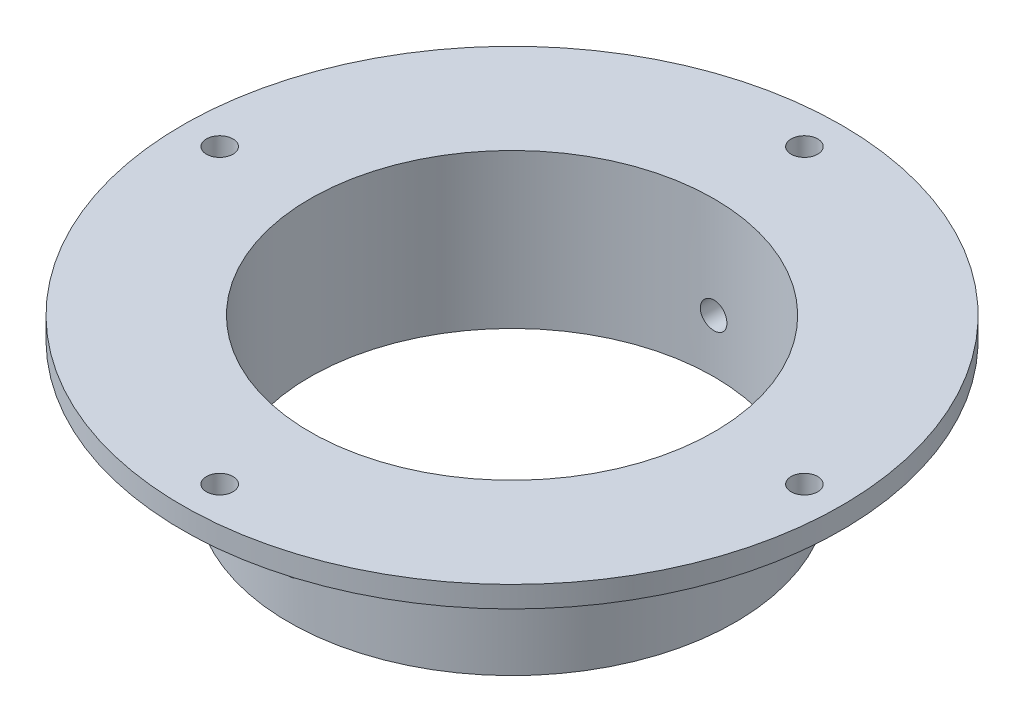
ISO-10303-21;
HEADER;
FILE_DESCRIPTION(('STEP AP214'),'2;1');
FILE_NAME('part.step','',(''),(''),'','','');
FILE_SCHEMA(('AUTOMOTIVE_DESIGN { 1 0 10303 214 1 1 1 1 }'));
ENDSEC;
DATA;
#1=APPLICATION_CONTEXT('core data for automotive mechanical design processes');
#2=APPLICATION_PROTOCOL_DEFINITION('international standard','automotive_design',2000,#1);
#3=PRODUCT_CONTEXT('',#1,'mechanical');
#4=PRODUCT('Part','Part','',(#3));
#5=PRODUCT_RELATED_PRODUCT_CATEGORY('part','',(#4));
#6=PRODUCT_DEFINITION_FORMATION('','',#4);
#7=PRODUCT_DEFINITION_CONTEXT('part definition',#1,'design');
#8=PRODUCT_DEFINITION('design','',#6,#7);
#9=PRODUCT_DEFINITION_SHAPE('','',#8);
#10=(LENGTH_UNIT() NAMED_UNIT(*) SI_UNIT(.MILLI.,.METRE.));
#11=(NAMED_UNIT(*) PLANE_ANGLE_UNIT() SI_UNIT($,.RADIAN.));
#12=(NAMED_UNIT(*) SI_UNIT($,.STERADIAN.) SOLID_ANGLE_UNIT());
#13=UNCERTAINTY_MEASURE_WITH_UNIT(LENGTH_MEASURE(1.E-05),#10,'distance_accuracy_value','');
#14=(GEOMETRIC_REPRESENTATION_CONTEXT(3) GLOBAL_UNCERTAINTY_ASSIGNED_CONTEXT((#13)) GLOBAL_UNIT_ASSIGNED_CONTEXT((#10,
#11,#12)) REPRESENTATION_CONTEXT('',''));
#15=CARTESIAN_POINT('',(0.,0.,0.));
#16=DIRECTION('',(0.,0.,1.));
#17=DIRECTION('',(1.,0.,0.));
#18=AXIS2_PLACEMENT_3D('',#15,#16,#17);
#19=CARTESIAN_POINT('',(0.,-100.5,0.));
#20=DIRECTION('',(0.,-1.,0.));
#21=DIRECTION('',(0.,0.,-1.));
#22=AXIS2_PLACEMENT_3D('',#19,#20,#21);
#23=CYLINDRICAL_SURFACE('',#22,62.);
#24=CARTESIAN_POINT('',(0.,-4.,0.));
#25=DIRECTION('',(0.,-1.,0.));
#26=DIRECTION('',(0.,0.,-1.));
#27=AXIS2_PLACEMENT_3D('',#24,#25,#26);
#28=CIRCLE('',#27,62.);
#29=CARTESIAN_POINT('',(0.,-4.,-62.));
#30=VERTEX_POINT('',#29);
#31=EDGE_CURVE('E144',#30,#30,#28,.T.);
#32=ORIENTED_EDGE('',*,*,#31,.F.);
#33=EDGE_LOOP('',(#32));
#34=FACE_BOUND('',#33,.T.);
#35=CARTESIAN_POINT('',(0.,0.,0.));
#36=DIRECTION('',(0.,-1.,0.));
#37=DIRECTION('',(0.,0.,-1.));
#38=AXIS2_PLACEMENT_3D('',#35,#36,#37);
#39=CIRCLE('',#38,62.);
#40=CARTESIAN_POINT('',(0.,0.,-62.));
#41=VERTEX_POINT('',#40);
#42=EDGE_CURVE('E10',#41,#41,#39,.T.);
#43=ORIENTED_EDGE('',*,*,#42,.T.);
#44=EDGE_LOOP('',(#43));
#45=FACE_BOUND('',#44,.T.);
#46=ADVANCED_FACE('F41',(#34,#45),#23,.T.);
#47=CARTESIAN_POINT('',(-62.,0.,0.));
#48=DIRECTION('',(0.,-1.,0.));
#49=DIRECTION('',(0.,0.,-1.));
#50=AXIS2_PLACEMENT_3D('',#47,#48,#49);
#51=PLANE('',#50);
#52=CARTESIAN_POINT('',(55.,0.,0.));
#53=DIRECTION('',(0.,-1.,0.));
#54=DIRECTION('',(0.,0.,-1.));
#55=AXIS2_PLACEMENT_3D('',#52,#53,#54);
#56=CIRCLE('',#55,2.49999999999999);
#57=CARTESIAN_POINT('',(55.,0.,-2.49999999999999));
#58=VERTEX_POINT('',#57);
#59=EDGE_CURVE('E114',#58,#58,#56,.T.);
#60=ORIENTED_EDGE('',*,*,#59,.T.);
#61=EDGE_LOOP('',(#60));
#62=FACE_BOUND('',#61,.T.);
#63=CARTESIAN_POINT('',(-55.,0.,0.));
#64=DIRECTION('',(0.,-1.,0.));
#65=DIRECTION('',(0.,0.,-1.));
#66=AXIS2_PLACEMENT_3D('',#63,#64,#65);
#67=CIRCLE('',#66,2.49999999999999);
#68=CARTESIAN_POINT('',(-55.,0.,-2.49999999999999));
#69=VERTEX_POINT('',#68);
#70=EDGE_CURVE('E118',#69,#69,#67,.T.);
#71=ORIENTED_EDGE('',*,*,#70,.T.);
#72=EDGE_LOOP('',(#71));
#73=FACE_BOUND('',#72,.T.);
#74=CARTESIAN_POINT('',(0.,0.,55.));
#75=DIRECTION('',(0.,-1.,0.));
#76=DIRECTION('',(0.,0.,-1.));
#77=AXIS2_PLACEMENT_3D('',#74,#75,#76);
#78=CIRCLE('',#77,2.5);
#79=CARTESIAN_POINT('',(0.,0.,52.5));
#80=VERTEX_POINT('',#79);
#81=EDGE_CURVE('E122',#80,#80,#78,.T.);
#82=ORIENTED_EDGE('',*,*,#81,.T.);
#83=EDGE_LOOP('',(#82));
#84=FACE_BOUND('',#83,.T.);
#85=CARTESIAN_POINT('',(0.,0.,-55.));
#86=DIRECTION('',(0.,-1.,0.));
#87=DIRECTION('',(0.,0.,-1.));
#88=AXIS2_PLACEMENT_3D('',#85,#86,#87);
#89=CIRCLE('',#88,2.5);
#90=CARTESIAN_POINT('',(0.,0.,-57.5));
#91=VERTEX_POINT('',#90);
#92=EDGE_CURVE('E126',#91,#91,#89,.T.);
#93=ORIENTED_EDGE('',*,*,#92,.T.);
#94=EDGE_LOOP('',(#93));
#95=FACE_BOUND('',#94,.T.);
#96=ORIENTED_EDGE('',*,*,#42,.F.);
#97=EDGE_LOOP('',(#96));
#98=FACE_BOUND('',#97,.T.);
#99=CARTESIAN_POINT('',(0.,0.,0.));
#100=DIRECTION('',(0.,-1.,0.));
#101=DIRECTION('',(0.,0.,-1.));
#102=AXIS2_PLACEMENT_3D('',#99,#100,#101);
#103=CIRCLE('',#102,38.);
#104=CARTESIAN_POINT('',(0.,0.,-38.));
#105=VERTEX_POINT('',#104);
#106=EDGE_CURVE('E54',#105,#105,#103,.T.);
#107=ORIENTED_EDGE('',*,*,#106,.T.);
#108=EDGE_LOOP('',(#107));
#109=FACE_BOUND('',#108,.T.);
#110=ADVANCED_FACE('F102',(#62,#73,#84,#95,#98,#109),#51,.F.);
#111=CARTESIAN_POINT('',(0.,-100.5,0.));
#112=DIRECTION('',(0.,-1.,0.));
#113=DIRECTION('',(0.,0.,-1.));
#114=AXIS2_PLACEMENT_3D('',#111,#112,#113);
#115=CYLINDRICAL_SURFACE('',#114,38.);
#116=CARTESIAN_POINT('',(0.,-16.5,-38.));
#117=CARTESIAN_POINT('',(0.140263338640111,-16.5000061657034,-37.9999989089088));
#118=CARTESIAN_POINT('',(0.280624510567204,-16.5118439540765,-37.9992151008519));
#119=CARTESIAN_POINT('',(0.557470077475564,-16.5588967165258,-37.9961636901737));
#120=CARTESIAN_POINT('',(0.693949785301588,-16.5941387990094,-37.993894366974));
#121=CARTESIAN_POINT('',(0.958982303444851,-16.6869825710089,-37.9881286089382));
#122=CARTESIAN_POINT('',(1.08753929536543,-16.7445723462569,-37.9846328280609));
#123=CARTESIAN_POINT('',(1.33312858370056,-16.8804571374235,-37.9768071728354));
#124=CARTESIAN_POINT('',(1.45016348693039,-16.9587474551055,-37.9724774878122));
#125=CARTESIAN_POINT('',(1.66961202724024,-17.1339515865147,-37.9634626250822));
#126=CARTESIAN_POINT('',(1.77200420008546,-17.230892261019,-37.9587769406168));
#127=CARTESIAN_POINT('',(1.95907706932224,-17.4405896661527,-37.9495824974991));
#128=CARTESIAN_POINT('',(2.04375702050908,-17.5533470619043,-37.9450737462973));
#129=CARTESIAN_POINT('',(2.19306912808149,-17.7916003582801,-37.9367376727092));
#130=CARTESIAN_POINT('',(2.25768324964759,-17.9171075845717,-37.9329109646397));
#131=CARTESIAN_POINT('',(2.36491418395718,-18.1772185275759,-37.9263771482206));
#132=CARTESIAN_POINT('',(2.40753125425532,-18.3118221377618,-37.9236700267624));
#133=CARTESIAN_POINT('',(2.46949823281524,-18.5860964566405,-37.9196855382056));
#134=CARTESIAN_POINT('',(2.4888820420221,-18.7257594753212,-37.9184060881012));
#135=CARTESIAN_POINT('',(2.50393692695256,-19.0063623003731,-37.9174149912351));
#136=CARTESIAN_POINT('',(2.49960829570425,-19.147302090945,-37.9177033250993));
#137=CARTESIAN_POINT('',(2.46738928684178,-19.4262265147583,-37.9198133472868));
#138=CARTESIAN_POINT('',(2.43953561602796,-19.5642154086451,-37.9216326467838));
#139=CARTESIAN_POINT('',(2.36111413978203,-19.8335549308764,-37.9265958226422));
#140=CARTESIAN_POINT('',(2.31054618626762,-19.9649055159373,-37.9297397076388));
#141=CARTESIAN_POINT('',(2.18808999165326,-20.2173576558678,-37.9370005183096));
#142=CARTESIAN_POINT('',(2.1161851246853,-20.3384511233859,-37.9411182022646));
#143=CARTESIAN_POINT('',(1.95310825671474,-20.5668632100567,-37.949861837488));
#144=CARTESIAN_POINT('',(1.86193601494282,-20.6741816570468,-37.9544877951075));
#145=CARTESIAN_POINT('',(1.66270582371165,-20.8722108732715,-37.9637372885605));
#146=CARTESIAN_POINT('',(1.5546161115177,-20.962889691217,-37.9683608030819));
#147=CARTESIAN_POINT('',(1.32473052430288,-21.1248190741905,-37.9770759456802));
#148=CARTESIAN_POINT('',(1.20293464399362,-21.1960696317222,-37.9811675735518));
#149=CARTESIAN_POINT('',(0.949074486518493,-21.3171173467021,-37.9883582687231));
#150=CARTESIAN_POINT('',(0.817009617015091,-21.3669132655151,-37.9914572787137));
#151=CARTESIAN_POINT('',(0.546369095952173,-21.4436166933401,-37.9963127799458));
#152=CARTESIAN_POINT('',(0.407793528652135,-21.470524498477,-37.9980692885564));
#153=CARTESIAN_POINT('',(0.128342446210268,-21.5006482288441,-38.0000396241101));
#154=CARTESIAN_POINT('',(-0.0125282882294702,-21.5039083237349,-38.000256327117));
#155=CARTESIAN_POINT('',(-0.292814563294638,-21.4867595416941,-37.9991302871387));
#156=CARTESIAN_POINT('',(-0.432230112318582,-21.4663508014419,-37.9977875531587));
#157=CARTESIAN_POINT('',(-0.705523880511251,-21.4024802560411,-37.9936956265147));
#158=CARTESIAN_POINT('',(-0.839406862626701,-21.3590387449292,-37.9909476720577));
#159=CARTESIAN_POINT('',(-1.0979821322638,-21.2503564304151,-37.9843543930686));
#160=CARTESIAN_POINT('',(-1.22267432827148,-21.1851154099879,-37.9805090576117));
#161=CARTESIAN_POINT('',(-1.45953056554176,-21.0345737907095,-37.972145780786));
#162=CARTESIAN_POINT('',(-1.57167584294263,-20.9492437250458,-37.9676268549948));
#163=CARTESIAN_POINT('',(-1.78006588645928,-20.7609890681081,-37.9584281419056));
#164=CARTESIAN_POINT('',(-1.87631047952118,-20.6580642853683,-37.9537483528577));
#165=CARTESIAN_POINT('',(-2.05031700979284,-20.4373511319252,-37.9447469988241));
#166=CARTESIAN_POINT('',(-2.12805026816539,-20.3195401252357,-37.94042599635));
#167=CARTESIAN_POINT('',(-2.26263133128356,-20.0725123600299,-37.9326384937239));
#168=CARTESIAN_POINT('',(-2.319479276074,-19.9432956780007,-37.9291719878422));
#169=CARTESIAN_POINT('',(-2.41062645747182,-19.6772288551144,-37.9234884778725));
#170=CARTESIAN_POINT('',(-2.44494367555515,-19.5403848963543,-37.9212704775707));
#171=CARTESIAN_POINT('',(-2.49011396544168,-19.2628623134452,-37.918331354935));
#172=CARTESIAN_POINT('',(-2.50096730016958,-19.1221837322829,-37.917610215828));
#173=CARTESIAN_POINT('',(-2.49889914486143,-18.8412703821744,-37.9177465482503));
#174=CARTESIAN_POINT('',(-2.48602273732584,-18.7010352776421,-37.9186010263749));
#175=CARTESIAN_POINT('',(-2.4369541559189,-18.4247230460584,-37.9217859619313));
#176=CARTESIAN_POINT('',(-2.40076194057309,-18.2886459264036,-37.9241164219887));
#177=CARTESIAN_POINT('',(-2.30609945749711,-18.0245061909025,-37.9299899650734));
#178=CARTESIAN_POINT('',(-2.24762947243981,-17.8964434733888,-37.9335330327144));
#179=CARTESIAN_POINT('',(-2.11007715990923,-17.6519462585653,-37.9414324891205));
#180=CARTESIAN_POINT('',(-2.03099533692235,-17.5355114767517,-37.9457888579789));
#181=CARTESIAN_POINT('',(-1.85429682254946,-17.3173461843869,-37.954833700614));
#182=CARTESIAN_POINT('',(-1.75664736286435,-17.2156422385455,-37.9595227521995));
#183=CARTESIAN_POINT('',(-1.54563286085883,-17.0300342107064,-37.9686995719977));
#184=CARTESIAN_POINT('',(-1.43226398542784,-16.9461344828543,-37.9731872907619));
#185=CARTESIAN_POINT('',(-1.19288750338034,-16.798447827037,-37.9814608860298));
#186=CARTESIAN_POINT('',(-1.06686338419818,-16.7346876386072,-37.985245826722));
#187=CARTESIAN_POINT('',(-0.805964550763279,-16.6293102471819,-37.9916751144093));
#188=CARTESIAN_POINT('',(-0.671100383637576,-16.5876671774824,-37.9943207931204));
#189=CARTESIAN_POINT('',(-0.446179257536459,-16.5384993453469,-37.9974820960572));
#190=CARTESIAN_POINT('',(-0.357575215516564,-16.5240808311296,-37.9984220996303));
#191=CARTESIAN_POINT('',(-0.179327446866825,-16.5048291947172,-37.9996813999403));
#192=CARTESIAN_POINT('',(-0.0896837218472607,-16.4999960576781,-38.0000006976386));
#193=CARTESIAN_POINT('',(0.,-16.5,-38.));
#194=B_SPLINE_CURVE_WITH_KNOTS('',3,(#116,#117,#118,#119,#120,#121,#122,#123,#124,#125,#126,
#127,#128,#129,#130,#131,#132,#133,#134,#135,#136,#137,#138,#139,#140,#141,#142,#143,#144,#145,
#146,#147,#148,#149,#150,#151,#152,#153,#154,#155,#156,#157,#158,#159,#160,#161,#162,#163,#164,
#165,#166,#167,#168,#169,#170,#171,#172,#173,#174,#175,#176,#177,#178,#179,#180,#181,#182,#183,
#184,#185,#186,#187,#188,#189,#190,#191,#192,#193),.UNSPECIFIED.,.T.,.F.,(4,2,2,2,2,2,2,2,2,2,2,
2,2,2,2,2,2,2,2,2,2,2,2,2,2,2,2,2,2,2,2,2,2,2,2,2,2,2,4),(0.,0.420462610994175,
0.841413081079643,1.26213943668888,1.68277038524409,2.10401173600149,2.52527080604525,
2.94690740790406,3.36853907287704,3.78955475970551,4.21056524381557,4.63092002409859,
5.0512775448603,5.47196347503219,5.89265466249842,6.31414539270181,6.73563628553364,
7.1571515089345,7.57866127871498,7.99938354099967,8.42010337376711,8.84045312732508,
9.26080706580026,9.68178146800256,10.1027604515455,10.5243874578755,10.9460116369673,
11.3672989129969,11.7885814682647,12.2090644828285,12.629548245355,13.0500266727249,
13.4704948096136,13.8917119970443,14.3130320776635,14.7349092218268,15.1562918740891,
15.4251341147867,15.693975939152),.UNSPECIFIED.);
#195=CARTESIAN_POINT('',(0.,-16.5,-38.));
#196=VERTEX_POINT('',#195);
#197=EDGE_CURVE('E93',#196,#196,#194,.T.);
#198=ORIENTED_EDGE('',*,*,#197,.T.);
#199=EDGE_LOOP('',(#198));
#200=FACE_BOUND('',#199,.T.);
#201=CARTESIAN_POINT('',(2.5,-19.,37.9176739792936));
#202=CARTESIAN_POINT('',(2.49999383396114,-18.8597370317807,37.9176750792177));
#203=CARTESIAN_POINT('',(2.48815610599765,-18.7193762290357,37.9184606296487));
#204=CARTESIAN_POINT('',(2.44110360532757,-18.4425314292272,37.9215182656392));
#205=CARTESIAN_POINT('',(2.40586172295285,-18.3060521196082,37.9237920750455));
#206=CARTESIAN_POINT('',(2.31301853640162,-18.0410204432686,37.9295675678257));
#207=CARTESIAN_POINT('',(2.25542915603201,-17.9124638915718,37.9330685963044));
#208=CARTESIAN_POINT('',(2.1195452946128,-17.6668753400403,37.9409032159641));
#209=CARTESIAN_POINT('',(2.04125551082236,-17.5498407339459,37.9452366182051));
#210=CARTESIAN_POINT('',(1.86605191732922,-17.3303918547827,37.9542557951937));
#211=CARTESIAN_POINT('',(1.76911112770861,-17.2279991408587,37.9589420743505));
#212=CARTESIAN_POINT('',(1.55941326560947,-17.0409252282869,37.9681342909321));
#213=CARTESIAN_POINT('',(1.44665552947979,-16.9562447731858,37.9726402207795));
#214=CARTESIAN_POINT('',(1.20840193818591,-16.8069321412701,37.980968448039));
#215=CARTESIAN_POINT('',(1.08289481585815,-16.742317906001,37.9847901323703));
#216=CARTESIAN_POINT('',(0.822784098903772,-16.6350867327497,37.991313925933));
#217=CARTESIAN_POINT('',(0.688180610236925,-16.5924695385831,37.9940160482031));
#218=CARTESIAN_POINT('',(0.413906649944332,-16.5305022973315,37.9979927668059));
#219=CARTESIAN_POINT('',(0.27424387041216,-16.511118339785,37.9992694434849));
#220=CARTESIAN_POINT('',(-0.00635848738819494,-16.4960630753301,38.0002584328232));
#221=CARTESIAN_POINT('',(-0.147298049941991,-16.5003914769697,37.9999707647101));
#222=CARTESIAN_POINT('',(-0.426223493960814,-16.5326101251371,37.9978652114935));
#223=CARTESIAN_POINT('',(-0.564213609097607,-16.5604638959155,37.9960496953125));
#224=CARTESIAN_POINT('',(-0.833555522314467,-16.6388859965182,37.9910955429301));
#225=CARTESIAN_POINT('',(-0.964907277764911,-16.6894544721892,37.9879568982333));
#226=CARTESIAN_POINT('',(-1.21736082544108,-16.8119117421081,37.9807057592349));
#227=CARTESIAN_POINT('',(-1.33845459003375,-16.8838170394276,37.9765925116199));
#228=CARTESIAN_POINT('',(-1.56686708778163,-17.0468948227736,37.9678549875776));
#229=CARTESIAN_POINT('',(-1.67418564858962,-17.1380675498251,37.9632307047577));
#230=CARTESIAN_POINT('',(-1.87221430610426,-17.3372980817875,37.9539810952395));
#231=CARTESIAN_POINT('',(-1.96289254980481,-17.4453875512519,37.9493557831635));
#232=CARTESIAN_POINT('',(-2.12482089033198,-17.6752724494904,37.940634326538));
#233=CARTESIAN_POINT('',(-2.19607097850101,-17.7970678843721,37.9365381822242));
#234=CARTESIAN_POINT('',(-2.31711835711865,-18.050927928623,37.929337691078));
#235=CARTESIAN_POINT('',(-2.36691426269517,-18.182993200263,37.9262334082738));
#236=CARTESIAN_POINT('',(-2.44361754049017,-18.4536345943001,37.9213689519858));
#237=CARTESIAN_POINT('',(-2.47052521122867,-18.5922106317555,37.9196087609718));
#238=CARTESIAN_POINT('',(-2.50064843582411,-18.871661921036,37.9176342832836));
#239=CARTESIAN_POINT('',(-2.50390828674319,-19.0125323783637,37.9174171062536));
#240=CARTESIAN_POINT('',(-2.48675911569962,-19.2928180403307,37.9185455955609));
#241=CARTESIAN_POINT('',(-2.4663502304005,-19.432233253368,37.9198912528743));
#242=CARTESIAN_POINT('',(-2.40247973559834,-19.7055254103698,37.9239911291788));
#243=CARTESIAN_POINT('',(-2.35903856489816,-19.8394071513576,37.926744099246));
#244=CARTESIAN_POINT('',(-2.25035734761923,-20.0979800896652,37.9333473147949));
#245=CARTESIAN_POINT('',(-2.18511708202147,-20.2226711946298,37.9371975713012));
#246=CARTESIAN_POINT('',(-2.03457656334725,-20.4595267068433,37.9455684924618));
#247=CARTESIAN_POINT('',(-1.94924665146512,-20.5716722281492,37.9500901446324));
#248=CARTESIAN_POINT('',(-1.76099216330583,-20.7800628355716,37.9592908826962));
#249=CARTESIAN_POINT('',(-1.65806739671881,-20.8763077496815,37.9639699702919));
#250=CARTESIAN_POINT('',(-1.43735409937778,-21.0503149476194,37.9729667977826));
#251=CARTESIAN_POINT('',(-1.31954293050926,-21.1280485502518,37.9772839703115));
#252=CARTESIAN_POINT('',(-1.072514751623,-21.2626302179293,37.9850623603036));
#253=CARTESIAN_POINT('',(-0.943297818113865,-21.3194784230582,37.9885235835078));
#254=CARTESIAN_POINT('',(-0.677231175163814,-21.4106257824592,37.9941973852559));
#255=CARTESIAN_POINT('',(-0.540387686510592,-21.4449430308756,37.9964109655532));
#256=CARTESIAN_POINT('',(-0.262866092954879,-21.490113540815,37.9993440696249));
#257=CARTESIAN_POINT('',(-0.122188030630966,-21.5009670627685,38.0000636099821));
#258=CARTESIAN_POINT('',(0.158725661755483,-21.498899442521,37.9999276075675));
#259=CARTESIAN_POINT('',(0.298961625635898,-21.4860231591756,37.9990750367152));
#260=CARTESIAN_POINT('',(0.575275606267386,-21.4369545233205,37.9958965684063));
#261=CARTESIAN_POINT('',(0.711353615895706,-21.4007621308715,37.993570668426));
#262=CARTESIAN_POINT('',(0.975495095772448,-21.3060989701103,37.9877069032466));
#263=CARTESIAN_POINT('',(1.10355866682703,-21.2476284820792,37.9841690532952));
#264=CARTESIAN_POINT('',(1.34805737805084,-21.1100749002662,37.9762784096942));
#265=CARTESIAN_POINT('',(1.46449280324947,-21.0309923119003,37.9719256360276));
#266=CARTESIAN_POINT('',(1.68265802851112,-20.8542929681005,37.9628848382199));
#267=CARTESIAN_POINT('',(1.78436140467434,-20.7566436185291,37.9581962336842));
#268=CARTESIAN_POINT('',(1.96996833469928,-20.5456295694054,37.9490169164664));
#269=CARTESIAN_POINT('',(2.05386753294152,-20.4322610354967,37.9445262524208));
#270=CARTESIAN_POINT('',(2.20155363291652,-20.1928848191154,37.9362446369121));
#271=CARTESIAN_POINT('',(2.26531369621352,-20.0668605631086,37.9324546219341));
#272=CARTESIAN_POINT('',(2.37069081552761,-19.8059614369942,37.9260153222171));
#273=CARTESIAN_POINT('',(2.41233374013708,-19.6710971148107,37.923364705513));
#274=CARTESIAN_POINT('',(2.46150115422085,-19.4461763784056,37.9201971892467));
#275=CARTESIAN_POINT('',(2.47591948050286,-19.3575729107008,37.919255230483));
#276=CARTESIAN_POINT('',(2.49517086717611,-19.1793262932595,37.9179932743498));
#277=CARTESIAN_POINT('',(2.50000394252144,-19.0896831451452,37.91767327601));
#278=CARTESIAN_POINT('',(2.5,-19.,37.9176739792936));
#279=B_SPLINE_CURVE_WITH_KNOTS('',3,(#201,#202,#203,#204,#205,#206,#207,#208,#209,#210,#211,
#212,#213,#214,#215,#216,#217,#218,#219,#220,#221,#222,#223,#224,#225,#226,#227,#228,#229,#230,
#231,#232,#233,#234,#235,#236,#237,#238,#239,#240,#241,#242,#243,#244,#245,#246,#247,#248,#249,
#250,#251,#252,#253,#254,#255,#256,#257,#258,#259,#260,#261,#262,#263,#264,#265,#266,#267,#268,
#269,#270,#271,#272,#273,#274,#275,#276,#277,#278),.UNSPECIFIED.,.T.,.F.,(4,2,2,2,2,2,2,2,2,2,2,
2,2,2,2,2,2,2,2,2,2,2,2,2,2,2,2,2,2,2,2,2,2,2,2,2,2,2,4),(0.,0.420461498480437,
0.841410880410041,1.26213596730298,1.68276566662256,2.10400847286644,2.52526895900484,
2.94690502397212,3.36853617832338,3.78955118149475,4.21056100991943,4.6309192643962,
5.05128021794909,5.47196715304151,5.89265935100818,6.31414862675712,6.73563809033018,
7.15715475706391,7.57866592607822,7.99938731660344,8.42010627789135,8.84045251737812,
9.26080298027823,9.68177795124709,10.1027574758629,10.524385077836,10.9460098517929,
11.3672956121168,11.7885766964457,12.2090622072308,12.6295484382853,13.0500293793715,
13.4705000110872,13.8917157147231,14.3130343462041,14.7349121022704,15.1562953299902,
15.4251358436647,15.6939759379172),.UNSPECIFIED.);
#280=CARTESIAN_POINT('',(2.5,-19.,37.9176739792936));
#281=VERTEX_POINT('',#280);
#282=EDGE_CURVE('E86',#281,#281,#279,.T.);
#283=ORIENTED_EDGE('',*,*,#282,.T.);
#284=EDGE_LOOP('',(#283));
#285=FACE_BOUND('',#284,.T.);
#286=ORIENTED_EDGE('',*,*,#106,.F.);
#287=EDGE_LOOP('',(#286));
#288=FACE_BOUND('',#287,.T.);
#289=CARTESIAN_POINT('',(0.,-29.,0.));
#290=DIRECTION('',(0.,-1.,0.));
#291=DIRECTION('',(0.,0.,-1.));
#292=AXIS2_PLACEMENT_3D('',#289,#290,#291);
#293=CIRCLE('',#292,38.);
#294=CARTESIAN_POINT('',(0.,-29.,-38.));
#295=VERTEX_POINT('',#294);
#296=EDGE_CURVE('E60',#295,#295,#293,.T.);
#297=ORIENTED_EDGE('',*,*,#296,.T.);
#298=EDGE_LOOP('',(#297));
#299=FACE_BOUND('',#298,.T.);
#300=ADVANCED_FACE('F98',(#200,#285,#288,#299),#115,.F.);
#301=CARTESIAN_POINT('',(-38.,-29.,0.));
#302=DIRECTION('',(0.,1.,0.));
#303=DIRECTION('',(0.,0.,1.));
#304=AXIS2_PLACEMENT_3D('',#301,#302,#303);
#305=PLANE('',#304);
#306=ORIENTED_EDGE('',*,*,#296,.F.);
#307=EDGE_LOOP('',(#306));
#308=FACE_BOUND('',#307,.T.);
#309=CARTESIAN_POINT('',(0.,-29.,0.));
#310=DIRECTION('',(0.,-1.,0.));
#311=DIRECTION('',(0.,0.,-1.));
#312=AXIS2_PLACEMENT_3D('',#309,#310,#311);
#313=CIRCLE('',#312,42.);
#314=CARTESIAN_POINT('',(0.,-29.,-42.));
#315=VERTEX_POINT('',#314);
#316=EDGE_CURVE('E135',#315,#315,#313,.T.);
#317=ORIENTED_EDGE('',*,*,#316,.T.);
#318=EDGE_LOOP('',(#317));
#319=FACE_BOUND('',#318,.T.);
#320=ADVANCED_FACE('F101',(#308,#319),#305,.F.);
#321=CARTESIAN_POINT('',(0.,-100.5,0.));
#322=DIRECTION('',(0.,-1.,0.));
#323=DIRECTION('',(0.,0.,-1.));
#324=AXIS2_PLACEMENT_3D('',#321,#322,#323);
#325=CYLINDRICAL_SURFACE('',#324,42.);
#326=CARTESIAN_POINT('',(0.,-16.5,-42.));
#327=CARTESIAN_POINT('',(-0.140292823403761,-16.5000061778345,-41.9999990092318));
#328=CARTESIAN_POINT('',(-0.280684204284274,-16.5118489231762,-41.9992895484228));
#329=CARTESIAN_POINT('',(-0.557591377372296,-16.5589225240946,-41.9965275746969));
#330=CARTESIAN_POINT('',(-0.694102450104736,-16.5941806878425,-41.9944734936602));
#331=CARTESIAN_POINT('',(-0.959197847303016,-16.6870696747175,-41.9892546810798));
#332=CARTESIAN_POINT('',(-1.08778627595049,-16.7446887992989,-41.9860905303724));
#333=CARTESIAN_POINT('',(-1.33343224501536,-16.8806453993888,-41.9790075810696));
#334=CARTESIAN_POINT('',(-1.45049243860934,-16.9589780923884,-41.9750889567296));
#335=CARTESIAN_POINT('',(-1.66995355891676,-17.1342563909029,-41.9669316101257));
#336=CARTESIAN_POINT('',(-1.7723366108726,-17.2312243610108,-41.9626925069944));
#337=CARTESIAN_POINT('',(-1.95938441950361,-17.4409748409374,-41.9543752335843));
#338=CARTESIAN_POINT('',(-2.04404844013653,-17.5537580073889,-41.9502970699965));
#339=CARTESIAN_POINT('',(-2.19330881812004,-17.792037125655,-41.9427586825521));
#340=CARTESIAN_POINT('',(-2.25789050248087,-17.9175422843254,-41.9392989112996));
#341=CARTESIAN_POINT('',(-2.36505903567176,-18.1776381526443,-41.9333923391349));
#342=CARTESIAN_POINT('',(-2.40764610301924,-18.3122287720134,-41.9309455281588));
#343=CARTESIAN_POINT('',(-2.46956736970121,-18.5865043348652,-41.9273443942944));
#344=CARTESIAN_POINT('',(-2.48892932602957,-18.7261829912655,-41.9261885286744));
#345=CARTESIAN_POINT('',(-2.50393643074634,-19.0068122619195,-41.9252950095929));
#346=CARTESIAN_POINT('',(-2.49958182669411,-19.1477628628809,-41.9255573413279));
#347=CARTESIAN_POINT('',(-2.46730247511534,-19.4267459391305,-41.9274692012365));
#348=CARTESIAN_POINT('',(-2.43940775185211,-19.5647819021253,-41.9291169623533));
#349=CARTESIAN_POINT('',(-2.36088655008652,-19.8342086678139,-41.9336111988677));
#350=CARTESIAN_POINT('',(-2.31025994572308,-19.9655994337102,-41.9364576809024));
#351=CARTESIAN_POINT('',(-2.18767794747578,-20.2181026332409,-41.9430306025052));
#352=CARTESIAN_POINT('',(-2.11570891601752,-20.3392084310508,-41.9467576044051));
#353=CARTESIAN_POINT('',(-1.95249489520469,-20.5676313908806,-41.9546709756181));
#354=CARTESIAN_POINT('',(-1.86124970996104,-20.6749484127577,-41.9588573495992));
#355=CARTESIAN_POINT('',(-1.66190431080461,-20.8729221870211,-41.9672255191714));
#356=CARTESIAN_POINT('',(-1.55377810872672,-20.9635527739842,-41.9714072975212));
#357=CARTESIAN_POINT('',(-1.32383114629526,-21.125379235161,-41.9792887388127));
#358=CARTESIAN_POINT('',(-1.20201038155937,-21.1965751031554,-41.9829884016003));
#359=CARTESIAN_POINT('',(-0.948116613439404,-21.3175088465948,-41.989488957971));
#360=CARTESIAN_POINT('',(-0.816043146499819,-21.3672457511481,-41.992289810887));
#361=CARTESIAN_POINT('',(-0.545400066040315,-21.4438323379125,-41.9966765619743));
#362=CARTESIAN_POINT('',(-0.406830521366639,-21.4706822626249,-41.9982624730187));
#363=CARTESIAN_POINT('',(-0.127355819821413,-21.5007003417193,-42.0000389682173));
#364=CARTESIAN_POINT('',(0.0135454380336807,-21.5039046762112,-42.0002316840899));
#365=CARTESIAN_POINT('',(0.293883502490564,-21.4866351188941,-41.9992057393038));
#366=CARTESIAN_POINT('',(0.433320315991767,-21.4661613386898,-41.9979870852975));
#367=CARTESIAN_POINT('',(0.706669609611324,-21.4021466814751,-41.9942769808842));
#368=CARTESIAN_POINT('',(0.840585985738623,-21.3586223833577,-41.9917864453134));
#369=CARTESIAN_POINT('',(1.09921320014772,-21.2497590156198,-41.9858128245104));
#370=CARTESIAN_POINT('',(1.22392396327394,-21.1844197679239,-41.9823297311761));
#371=CARTESIAN_POINT('',(1.46076566738632,-21.0336890044892,-41.9747571743332));
#372=CARTESIAN_POINT('',(1.57288119173645,-20.9482733019232,-41.970666981638));
#373=CARTESIAN_POINT('',(1.78119472230239,-20.7598495065704,-41.9623430607521));
#374=CARTESIAN_POINT('',(1.87739258593544,-20.6568412562149,-41.9581093312761));
#375=CARTESIAN_POINT('',(2.0512624559693,-20.4360004132014,-41.9499693598245));
#376=CARTESIAN_POINT('',(2.12891100670341,-20.3181493361685,-41.9460635364905));
#377=CARTESIAN_POINT('',(2.26331768529371,-20.071061227428,-41.9390264803887));
#378=CARTESIAN_POINT('',(2.32007593224219,-19.9418242606347,-41.9358952432051));
#379=CARTESIAN_POINT('',(2.41105015469958,-19.6757189252618,-41.9307634831971));
#380=CARTESIAN_POINT('',(2.4452809421472,-19.5388556353836,-41.9287622175328));
#381=CARTESIAN_POINT('',(2.4902769519356,-19.2613120184019,-41.926114016987));
#382=CARTESIAN_POINT('',(2.50104238136454,-19.1206317249956,-41.9254670701532));
#383=CARTESIAN_POINT('',(2.49880011110168,-18.8396807796046,-41.9256007528206));
#384=CARTESIAN_POINT('',(2.48582929240174,-18.6994098307263,-41.9263791676195));
#385=CARTESIAN_POINT('',(2.43655912711061,-18.4230411692451,-41.9292711624242));
#386=CARTESIAN_POINT('',(2.40025973762997,-18.2869434643152,-41.9313847448847));
#387=CARTESIAN_POINT('',(2.30537096560147,-18.0227785452928,-41.9367083518639));
#388=CARTESIAN_POINT('',(2.24678164695943,-17.8947113081779,-41.9399183732392));
#389=CARTESIAN_POINT('',(2.10898147807949,-17.6502270635601,-41.9470730356329));
#390=CARTESIAN_POINT('',(2.02977118737896,-17.5338097400626,-41.9510176567177));
#391=CARTESIAN_POINT('',(1.85284200050245,-17.3157434857965,-41.9592040971666));
#392=CARTESIAN_POINT('',(1.75509662102532,-17.2141160589173,-41.9634463362411));
#393=CARTESIAN_POINT('',(1.54390408840861,-17.0286782880963,-41.9717464871975));
#394=CARTESIAN_POINT('',(1.43045309406607,-16.9448723155947,-41.9758043536632));
#395=CARTESIAN_POINT('',(1.19095105108669,-16.7974005496322,-41.9832823511411));
#396=CARTESIAN_POINT('',(1.06488548278906,-16.7337583242822,-41.9867017339688));
#397=CARTESIAN_POINT('',(0.803930316671382,-16.6286207786243,-41.9925071672673));
#398=CARTESIAN_POINT('',(0.669051286101085,-16.5870994633564,-41.9948944299893));
#399=CARTESIAN_POINT('',(0.4444531130362,-16.5381997754668,-41.9977395331763));
#400=CARTESIAN_POINT('',(0.356186544501361,-16.5238933222013,-41.9985834518248));
#401=CARTESIAN_POINT('',(0.17862663707193,-16.5047914734674,-41.9997140003328));
#402=CARTESIAN_POINT('',(0.0893332994531017,-16.4999960661827,-42.0000006308847));
#403=CARTESIAN_POINT('',(0.,-16.5,-42.));
#404=B_SPLINE_CURVE_WITH_KNOTS('',3,(#326,#327,#328,#329,#330,#331,#332,#333,#334,#335,#336,
#337,#338,#339,#340,#341,#342,#343,#344,#345,#346,#347,#348,#349,#350,#351,#352,#353,#354,#355,
#356,#357,#358,#359,#360,#361,#362,#363,#364,#365,#366,#367,#368,#369,#370,#371,#372,#373,#374,
#375,#376,#377,#378,#379,#380,#381,#382,#383,#384,#385,#386,#387,#388,#389,#390,#391,#392,#393,
#394,#395,#396,#397,#398,#399,#400,#401,#402,#403),.UNSPECIFIED.,.T.,.F.,(4,2,2,2,2,2,2,2,2,2,2,
2,2,2,2,2,2,2,2,2,2,2,2,2,2,2,2,2,2,2,2,2,2,2,2,2,2,2,4),(0.,0.420552355751795,
0.841596042934004,1.26241974971624,1.68314637817446,2.10438111886029,2.52563335401574,
2.94719265428784,3.36874776627044,3.78979856211866,4.21084496294227,4.63135515004549,
5.05186766544362,5.47264946479953,5.89343554045079,6.31487591886366,6.73631643213938,
7.15777601111872,7.5792311244262,8.00004123542599,8.42084936297961,8.84135523801498,
9.26186454572427,9.68288307651011,10.1039053783737,10.5254572791614,10.9470067767115,
11.3682788253012,11.7895471560358,12.2101614826579,12.6307765825796,13.0513904765956,
13.471992958702,13.8932009970164,14.3145122349482,14.7363141152246,15.1576192236983,
15.4254117970859,15.6932040377763),.UNSPECIFIED.);
#405=CARTESIAN_POINT('',(0.,-16.5,-42.));
#406=VERTEX_POINT('',#405);
#407=EDGE_CURVE('E44',#406,#406,#404,.T.);
#408=ORIENTED_EDGE('',*,*,#407,.T.);
#409=EDGE_LOOP('',(#408));
#410=FACE_BOUND('',#409,.T.);
#411=CARTESIAN_POINT('',(2.5,-19.,41.925529215503));
#412=CARTESIAN_POINT('',(2.49999382194034,-19.1402925751289,41.9255302128407));
#413=CARTESIAN_POINT('',(2.48815111709649,-19.2806837085716,41.926240964523));
#414=CARTESIAN_POINT('',(2.44107769167266,-19.557590367522,41.9290075503402));
#415=CARTESIAN_POINT('',(2.4058196620784,-19.6941011733608,41.9310649550201));
#416=CARTESIAN_POINT('',(2.3129310676967,-19.9591960063699,41.9362909801877));
#417=CARTESIAN_POINT('',(2.2553122078524,-20.0877841399825,41.9394590192221));
#418=CARTESIAN_POINT('',(2.11935623107359,-20.333429615328,41.9465486105512));
#419=CARTESIAN_POINT('',(2.04102389599195,-20.4504896098644,41.9504699888752));
#420=CARTESIAN_POINT('',(1.86574595795634,-20.6699509575062,41.9586305262896));
#421=CARTESIAN_POINT('',(1.76877791055223,-20.7723343721927,41.9628700647738));
#422=CARTESIAN_POINT('',(1.55902712407918,-20.9593828801655,41.9711856794122));
#423=CARTESIAN_POINT('',(1.44624372936307,-21.0440472385209,41.9752617487806));
#424=CARTESIAN_POINT('',(1.20796441364424,-21.1933079676637,41.982794321555));
#425=CARTESIAN_POINT('',(1.08245932501608,-21.2578897280448,41.9862503731187));
#426=CARTESIAN_POINT('',(0.822363608997768,-21.3650584211412,41.9921495258689));
#427=CARTESIAN_POINT('',(0.687773071507469,-21.4076455714555,41.9945926370767));
#428=CARTESIAN_POINT('',(0.413497748996246,-21.4695670144676,41.998188020733));
#429=CARTESIAN_POINT('',(0.273819252429754,-21.4889290704032,41.9993418342926));
#430=CARTESIAN_POINT('',(-0.00680970603859034,-21.5039364297023,42.0002337950062));
#431=CARTESIAN_POINT('',(-0.14776015470486,-21.4995819795697,41.9999719568741));
#432=CARTESIAN_POINT('',(-0.426743915585598,-21.4673028695132,41.9980634075852));
#433=CARTESIAN_POINT('',(-0.56478069743045,-21.439408078973,41.9964184514206));
#434=CARTESIAN_POINT('',(-0.834209066157913,-21.3608864579672,41.9919309051649));
#435=CARTESIAN_POINT('',(-0.965600616682704,-21.3102595031427,41.9890883085221));
#436=CARTESIAN_POINT('',(-1.21810475890474,-21.1876767837351,41.9825225540955));
#437=CARTESIAN_POINT('',(-1.33921075491856,-21.1157074640885,41.978798836995));
#438=CARTESIAN_POINT('',(-1.56763398850681,-20.9524928305909,41.970889987012));
#439=CARTESIAN_POINT('',(-1.67495108581239,-20.861247320676,41.9667048494364));
#440=CARTESIAN_POINT('',(-1.87292448525118,-20.6619016938893,41.9583365805745));
#441=CARTESIAN_POINT('',(-1.96355468774436,-20.5537756544522,41.9541534624682));
#442=CARTESIAN_POINT('',(-2.12538045109028,-20.3238291534399,41.9462673317677));
#443=CARTESIAN_POINT('',(-2.19657600494884,-20.2020086869362,41.9425643193463));
#444=CARTESIAN_POINT('',(-2.31750952338217,-19.9481149939095,41.9360565076845));
#445=CARTESIAN_POINT('',(-2.36724641906977,-19.8160412570427,41.9332517531895));
#446=CARTESIAN_POINT('',(-2.44383290513688,-19.5453975907216,41.9288583786538));
#447=CARTESIAN_POINT('',(-2.47068273962106,-19.4068277305691,41.9272697456426));
#448=CARTESIAN_POINT('',(-2.50070047928878,-19.1273528913639,41.9254901903088));
#449=CARTESIAN_POINT('',(-2.50390465022924,-18.9864518205604,41.9252971275857));
#450=CARTESIAN_POINT('',(-2.48663483259784,-18.7061141696986,41.9263248943086));
#451=CARTESIAN_POINT('',(-2.46616095561786,-18.5666775827414,41.927545717091));
#452=CARTESIAN_POINT('',(-2.40214633357142,-18.2933293699911,41.9312617163238));
#453=CARTESIAN_POINT('',(-2.35862226421821,-18.1594138253817,41.9337559714597));
#454=CARTESIAN_POINT('',(-2.24975963306234,-17.9007881725511,41.9397369587496));
#455=CARTESIAN_POINT('',(-2.18442089184556,-17.7760781400506,41.9432236990662));
#456=CARTESIAN_POINT('',(-2.03369086589333,-17.5392369196978,41.9508019115522));
#457=CARTESIAN_POINT('',(-1.94827526548689,-17.4271212305092,41.954894114771));
#458=CARTESIAN_POINT('',(-1.75985158096383,-17.21880731965,41.9632195157542));
#459=CARTESIAN_POINT('',(-1.65684334005685,-17.1226092398567,41.967452714775));
#460=CARTESIAN_POINT('',(-1.43600239981808,-16.9487389227189,41.9755893148652));
#461=CARTESIAN_POINT('',(-1.31815121499828,-16.8710901422688,41.9794922943649));
#462=CARTESIAN_POINT('',(-1.07106283132569,-16.7366830602113,41.9865225940873));
#463=CARTESIAN_POINT('',(-0.941825697398172,-16.6799246394919,41.9896499187324));
#464=CARTESIAN_POINT('',(-0.675720483776896,-16.5889502976258,41.9947744966252));
#465=CARTESIAN_POINT('',(-0.538857508538321,-16.554719489358,41.9967724960514));
#466=CARTESIAN_POINT('',(-0.261314553519062,-16.5097233312437,41.9994162548204));
#467=CARTESIAN_POINT('',(-0.120634607163985,-16.4989577759768,42.000062026001));
#468=CARTESIAN_POINT('',(0.160316570288484,-16.5011996876843,41.999928601295));
#469=CARTESIAN_POINT('',(0.300588097014355,-16.5141704237582,41.9991516070762));
#470=CARTESIAN_POINT('',(0.576957934313931,-16.5634406274792,41.9962644164412));
#471=CARTESIAN_POINT('',(0.71305623739979,-16.5997401369815,41.9941542176329));
#472=CARTESIAN_POINT('',(0.977222325043588,-16.6946293652698,41.9888378604138));
#473=CARTESIAN_POINT('',(1.10529013224298,-16.7532190212069,41.985631705093));
#474=CARTESIAN_POINT('',(1.3497753756689,-16.8910200404639,41.9784835666169));
#475=CARTESIAN_POINT('',(1.46619312824059,-16.9702308436276,41.9745416034499));
#476=CARTESIAN_POINT('',(1.68425933477499,-17.1471605846358,41.9663581377852));
#477=CARTESIAN_POINT('',(1.7858863792527,-17.2449058892626,41.9621162140276));
#478=CARTESIAN_POINT('',(1.97132341360752,-17.4560981161787,41.9538141841207));
#479=CARTESIAN_POINT('',(2.05512903105704,-17.5695488805039,41.9497541227831));
#480=CARTESIAN_POINT('',(2.20260042573444,-17.8090507457673,41.9422701698928));
#481=CARTESIAN_POINT('',(2.26624256817968,-17.9351164073792,41.9388470268338));
#482=CARTESIAN_POINT('',(2.37137993278527,-18.1960717733023,41.9330341827762));
#483=CARTESIAN_POINT('',(2.41290115117576,-18.3309509098289,41.9306432693442));
#484=CARTESIAN_POINT('',(2.46180055905882,-18.5555488225717,41.9277935843204));
#485=CARTESIAN_POINT('',(2.47610688648337,-18.6438150050349,41.9269482276637));
#486=CARTESIAN_POINT('',(2.4952085679855,-18.8213741385316,41.9258157260708));
#487=CARTESIAN_POINT('',(2.50000393395059,-18.9106670882817,41.9255285804368));
#488=CARTESIAN_POINT('',(2.5,-19.,41.925529215503));
#489=B_SPLINE_CURVE_WITH_KNOTS('',3,(#411,#412,#413,#414,#415,#416,#417,#418,#419,#420,#421,
#422,#423,#424,#425,#426,#427,#428,#429,#430,#431,#432,#433,#434,#435,#436,#437,#438,#439,#440,
#441,#442,#443,#444,#445,#446,#447,#448,#449,#450,#451,#452,#453,#454,#455,#456,#457,#458,#459,
#460,#461,#462,#463,#464,#465,#466,#467,#468,#469,#470,#471,#472,#473,#474,#475,#476,#477,#478,
#479,#480,#481,#482,#483,#484,#485,#486,#487,#488),.UNSPECIFIED.,.T.,.F.,(4,2,2,2,2,2,2,2,2,2,2,
2,2,2,2,2,2,2,2,2,2,2,2,2,2,2,2,2,2,2,2,2,2,2,2,2,2,2,4),(0.,0.42055161010252,0.841594567931984,
1.26241742432477,1.68314321545964,2.10437893162665,2.52563211587023,2.94719105529383,
3.36874582403386,3.78979616312661,4.21084212592661,4.63135464245496,5.05186945946983,
5.47265192994609,5.89343868053226,6.3148780858441,6.73631764282432,7.15777818990291,
7.57923424178776,8.00004376474441,8.42085130448308,8.84135482510295,9.26186180422673,
9.68288071997477,10.1039033881529,10.5254556836667,10.9470055755493,11.3682766104126,
11.7895439573523,12.2101599621721,12.6307767216421,13.0513922951579,13.4719964441927,
13.8932034865549,14.3145137517308,14.7363160476209,15.1576215472088,15.4254129594094,
15.6932040369042),.UNSPECIFIED.);
#490=CARTESIAN_POINT('',(2.5,-19.,41.925529215503));
#491=VERTEX_POINT('',#490);
#492=EDGE_CURVE('E63',#491,#491,#489,.T.);
#493=ORIENTED_EDGE('',*,*,#492,.T.);
#494=EDGE_LOOP('',(#493));
#495=FACE_BOUND('',#494,.T.);
#496=ORIENTED_EDGE('',*,*,#316,.F.);
#497=EDGE_LOOP('',(#496));
#498=FACE_BOUND('',#497,.T.);
#499=CARTESIAN_POINT('',(0.,-4.,0.));
#500=DIRECTION('',(0.,-1.,0.));
#501=DIRECTION('',(0.,0.,-1.));
#502=AXIS2_PLACEMENT_3D('',#499,#500,#501);
#503=CIRCLE('',#502,42.);
#504=CARTESIAN_POINT('',(0.,-4.,-42.));
#505=VERTEX_POINT('',#504);
#506=EDGE_CURVE('E138',#505,#505,#503,.T.);
#507=ORIENTED_EDGE('',*,*,#506,.T.);
#508=EDGE_LOOP('',(#507));
#509=FACE_BOUND('',#508,.T.);
#510=ADVANCED_FACE('F69',(#410,#495,#498,#509),#325,.T.);
#511=CARTESIAN_POINT('',(-42.,-4.,0.));
#512=DIRECTION('',(0.,1.,0.));
#513=DIRECTION('',(0.,0.,1.));
#514=AXIS2_PLACEMENT_3D('',#511,#512,#513);
#515=PLANE('',#514);
#516=CARTESIAN_POINT('',(55.,-4.,0.));
#517=DIRECTION('',(0.,-1.,0.));
#518=DIRECTION('',(0.,0.,-1.));
#519=AXIS2_PLACEMENT_3D('',#516,#517,#518);
#520=CIRCLE('',#519,2.49999999999999);
#521=CARTESIAN_POINT('',(55.,-4.,-2.49999999999999));
#522=VERTEX_POINT('',#521);
#523=EDGE_CURVE('E166',#522,#522,#520,.T.);
#524=ORIENTED_EDGE('',*,*,#523,.F.);
#525=EDGE_LOOP('',(#524));
#526=FACE_BOUND('',#525,.T.);
#527=CARTESIAN_POINT('',(-55.,-4.,0.));
#528=DIRECTION('',(0.,-1.,0.));
#529=DIRECTION('',(0.,0.,-1.));
#530=AXIS2_PLACEMENT_3D('',#527,#528,#529);
#531=CIRCLE('',#530,2.49999999999999);
#532=CARTESIAN_POINT('',(-55.,-4.,-2.49999999999999));
#533=VERTEX_POINT('',#532);
#534=EDGE_CURVE('E162',#533,#533,#531,.T.);
#535=ORIENTED_EDGE('',*,*,#534,.F.);
#536=EDGE_LOOP('',(#535));
#537=FACE_BOUND('',#536,.T.);
#538=CARTESIAN_POINT('',(0.,-4.,55.));
#539=DIRECTION('',(0.,-1.,0.));
#540=DIRECTION('',(0.,0.,-1.));
#541=AXIS2_PLACEMENT_3D('',#538,#539,#540);
#542=CIRCLE('',#541,2.5);
#543=CARTESIAN_POINT('',(0.,-4.,52.5));
#544=VERTEX_POINT('',#543);
#545=EDGE_CURVE('E156',#544,#544,#542,.T.);
#546=ORIENTED_EDGE('',*,*,#545,.F.);
#547=EDGE_LOOP('',(#546));
#548=FACE_BOUND('',#547,.T.);
#549=CARTESIAN_POINT('',(0.,-4.,-55.));
#550=DIRECTION('',(0.,-1.,0.));
#551=DIRECTION('',(0.,0.,-1.));
#552=AXIS2_PLACEMENT_3D('',#549,#550,#551);
#553=CIRCLE('',#552,2.5);
#554=CARTESIAN_POINT('',(0.,-4.,-57.5));
#555=VERTEX_POINT('',#554);
#556=EDGE_CURVE('E150',#555,#555,#553,.T.);
#557=ORIENTED_EDGE('',*,*,#556,.F.);
#558=EDGE_LOOP('',(#557));
#559=FACE_BOUND('',#558,.T.);
#560=ORIENTED_EDGE('',*,*,#506,.F.);
#561=EDGE_LOOP('',(#560));
#562=FACE_BOUND('',#561,.T.);
#563=ORIENTED_EDGE('',*,*,#31,.T.);
#564=EDGE_LOOP('',(#563));
#565=FACE_BOUND('',#564,.T.);
#566=ADVANCED_FACE('F192',(#526,#537,#548,#559,#562,#565),#515,.F.);
#567=CARTESIAN_POINT('',(0.,0.,-55.));
#568=DIRECTION('',(0.,-1.,0.));
#569=DIRECTION('',(0.,0.,-1.));
#570=AXIS2_PLACEMENT_3D('',#567,#568,#569);
#571=CYLINDRICAL_SURFACE('',#570,2.5);
#572=ORIENTED_EDGE('',*,*,#92,.F.);
#573=EDGE_LOOP('',(#572));
#574=FACE_BOUND('',#573,.T.);
#575=ORIENTED_EDGE('',*,*,#556,.T.);
#576=EDGE_LOOP('',(#575));
#577=FACE_BOUND('',#576,.T.);
#578=ADVANCED_FACE('F199',(#574,#577),#571,.F.);
#579=CARTESIAN_POINT('',(0.,0.,55.));
#580=DIRECTION('',(0.,-1.,0.));
#581=DIRECTION('',(0.,0.,-1.));
#582=AXIS2_PLACEMENT_3D('',#579,#580,#581);
#583=CYLINDRICAL_SURFACE('',#582,2.5);
#584=ORIENTED_EDGE('',*,*,#81,.F.);
#585=EDGE_LOOP('',(#584));
#586=FACE_BOUND('',#585,.T.);
#587=ORIENTED_EDGE('',*,*,#545,.T.);
#588=EDGE_LOOP('',(#587));
#589=FACE_BOUND('',#588,.T.);
#590=ADVANCED_FACE('F205',(#586,#589),#583,.F.);
#591=CARTESIAN_POINT('',(-55.,0.,0.));
#592=DIRECTION('',(0.,-1.,0.));
#593=DIRECTION('',(0.,0.,-1.));
#594=AXIS2_PLACEMENT_3D('',#591,#592,#593);
#595=CYLINDRICAL_SURFACE('',#594,2.49999999999999);
#596=ORIENTED_EDGE('',*,*,#70,.F.);
#597=EDGE_LOOP('',(#596));
#598=FACE_BOUND('',#597,.T.);
#599=ORIENTED_EDGE('',*,*,#534,.T.);
#600=EDGE_LOOP('',(#599));
#601=FACE_BOUND('',#600,.T.);
#602=ADVANCED_FACE('F187',(#598,#601),#595,.F.);
#603=CARTESIAN_POINT('',(55.,0.,0.));
#604=DIRECTION('',(0.,-1.,0.));
#605=DIRECTION('',(0.,0.,-1.));
#606=AXIS2_PLACEMENT_3D('',#603,#604,#605);
#607=CYLINDRICAL_SURFACE('',#606,2.49999999999999);
#608=ORIENTED_EDGE('',*,*,#59,.F.);
#609=EDGE_LOOP('',(#608));
#610=FACE_BOUND('',#609,.T.);
#611=ORIENTED_EDGE('',*,*,#523,.T.);
#612=EDGE_LOOP('',(#611));
#613=FACE_BOUND('',#612,.T.);
#614=ADVANCED_FACE('F79',(#610,#613),#607,.F.);
#615=CARTESIAN_POINT('',(0.,-19.,-62.));
#616=DIRECTION('',(0.,0.,1.));
#617=DIRECTION('',(1.,0.,0.));
#618=AXIS2_PLACEMENT_3D('',#615,#616,#617);
#619=CYLINDRICAL_SURFACE('',#618,2.5);
#620=ORIENTED_EDGE('',*,*,#492,.F.);
#621=EDGE_LOOP('',(#620));
#622=FACE_BOUND('',#621,.T.);
#623=ORIENTED_EDGE('',*,*,#282,.F.);
#624=EDGE_LOOP('',(#623));
#625=FACE_BOUND('',#624,.T.);
#626=ADVANCED_FACE('F77',(#622,#625),#619,.F.);
#627=ORIENTED_EDGE('',*,*,#407,.F.);
#628=EDGE_LOOP('',(#627));
#629=FACE_BOUND('',#628,.T.);
#630=ORIENTED_EDGE('',*,*,#197,.F.);
#631=EDGE_LOOP('',(#630));
#632=FACE_BOUND('',#631,.T.);
#633=ADVANCED_FACE('F73',(#629,#632),#619,.F.);
#634=CLOSED_SHELL('',(#46,#110,#300,#320,#510,#566,#578,#590,#602,#614,#626,#633));
#635=MANIFOLD_SOLID_BREP('B2',#634);
#636=ADVANCED_BREP_SHAPE_REPRESENTATION('',(#18,#635),#14);
#637=SHAPE_DEFINITION_REPRESENTATION(#9,#636);
ENDSEC;
END-ISO-10303-21;
